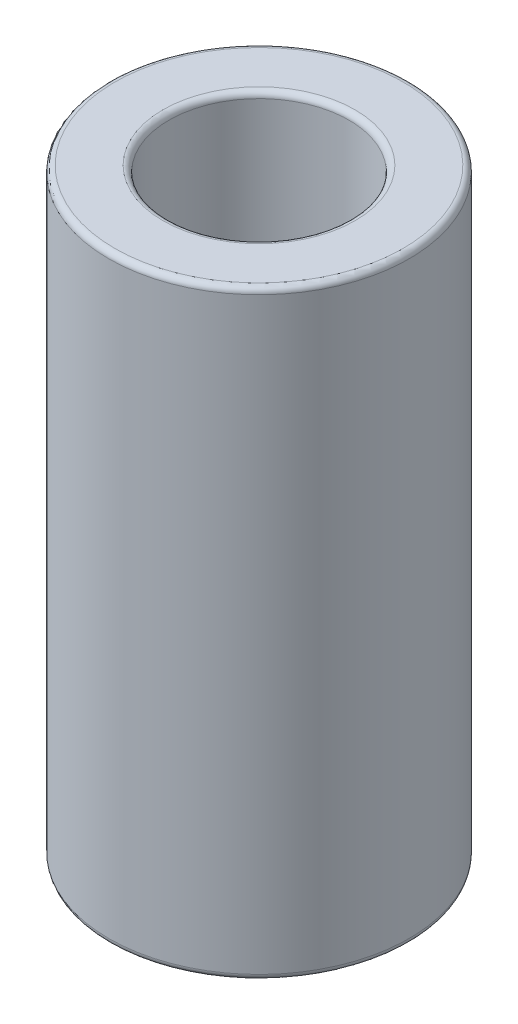
ISO-10303-21;
HEADER;
FILE_DESCRIPTION(('STEP AP214'),'2;1');
FILE_NAME('part.step','',(''),(''),'','','');
FILE_SCHEMA(('AUTOMOTIVE_DESIGN { 1 0 10303 214 1 1 1 1 }'));
ENDSEC;
DATA;
#1=APPLICATION_CONTEXT('core data for automotive mechanical design processes');
#2=APPLICATION_PROTOCOL_DEFINITION('international standard','automotive_design',2000,#1);
#3=PRODUCT_CONTEXT('',#1,'mechanical');
#4=PRODUCT('Part','Part','',(#3));
#5=PRODUCT_RELATED_PRODUCT_CATEGORY('part','',(#4));
#6=PRODUCT_DEFINITION_FORMATION('','',#4);
#7=PRODUCT_DEFINITION_CONTEXT('part definition',#1,'design');
#8=PRODUCT_DEFINITION('design','',#6,#7);
#9=PRODUCT_DEFINITION_SHAPE('','',#8);
#10=(LENGTH_UNIT() NAMED_UNIT(*) SI_UNIT(.MILLI.,.METRE.));
#11=(NAMED_UNIT(*) PLANE_ANGLE_UNIT() SI_UNIT($,.RADIAN.));
#12=(NAMED_UNIT(*) SI_UNIT($,.STERADIAN.) SOLID_ANGLE_UNIT());
#13=UNCERTAINTY_MEASURE_WITH_UNIT(LENGTH_MEASURE(1.E-05),#10,'distance_accuracy_value','');
#14=(GEOMETRIC_REPRESENTATION_CONTEXT(3) GLOBAL_UNCERTAINTY_ASSIGNED_CONTEXT((#13)) GLOBAL_UNIT_ASSIGNED_CONTEXT((#10,
#11,#12)) REPRESENTATION_CONTEXT('',''));
#15=CARTESIAN_POINT('',(0.,0.,0.));
#16=DIRECTION('',(0.,0.,1.));
#17=DIRECTION('',(1.,0.,0.));
#18=AXIS2_PLACEMENT_3D('',#15,#16,#17);
#19=CARTESIAN_POINT('',(0.,10.,0.));
#20=DIRECTION('',(0.,1.,0.));
#21=DIRECTION('',(0.,0.,1.));
#22=AXIS2_PLACEMENT_3D('',#19,#20,#21);
#23=PLANE('',#22);
#24=CARTESIAN_POINT('',(0.,10.,0.));
#25=DIRECTION('',(0.,1.,0.));
#26=DIRECTION('',(0.,0.,1.));
#27=AXIS2_PLACEMENT_3D('',#24,#25,#26);
#28=CIRCLE('',#27,1.6);
#29=CARTESIAN_POINT('',(0.,10.,1.6));
#30=VERTEX_POINT('',#29);
#31=EDGE_CURVE('E44',#30,#30,#28,.F.);
#32=ORIENTED_EDGE('',*,*,#31,.T.);
#33=EDGE_LOOP('',(#32));
#34=FACE_BOUND('',#33,.T.);
#35=CARTESIAN_POINT('',(0.,10.,0.));
#36=DIRECTION('',(0.,1.,0.));
#37=DIRECTION('',(0.,0.,1.));
#38=AXIS2_PLACEMENT_3D('',#35,#36,#37);
#39=CIRCLE('',#38,2.4);
#40=CARTESIAN_POINT('',(0.,10.,2.4));
#41=VERTEX_POINT('',#40);
#42=EDGE_CURVE('E48',#41,#41,#39,.T.);
#43=ORIENTED_EDGE('',*,*,#42,.T.);
#44=EDGE_LOOP('',(#43));
#45=FACE_BOUND('',#44,.T.);
#46=ADVANCED_FACE('F33',(#34,#45),#23,.T.);
#47=CARTESIAN_POINT('',(0.,0.,0.));
#48=DIRECTION('',(0.,1.,0.));
#49=DIRECTION('',(0.,0.,1.));
#50=AXIS2_PLACEMENT_3D('',#47,#48,#49);
#51=PLANE('',#50);
#52=CARTESIAN_POINT('',(0.,0.,0.));
#53=DIRECTION('',(0.,1.,0.));
#54=DIRECTION('',(0.,0.,1.));
#55=AXIS2_PLACEMENT_3D('',#52,#53,#54);
#56=CIRCLE('',#55,1.6);
#57=CARTESIAN_POINT('',(0.,0.,1.6));
#58=VERTEX_POINT('',#57);
#59=EDGE_CURVE('E59',#58,#58,#56,.T.);
#60=ORIENTED_EDGE('',*,*,#59,.T.);
#61=EDGE_LOOP('',(#60));
#62=FACE_BOUND('',#61,.T.);
#63=CARTESIAN_POINT('',(0.,0.,0.));
#64=DIRECTION('',(0.,1.,0.));
#65=DIRECTION('',(0.,0.,1.));
#66=AXIS2_PLACEMENT_3D('',#63,#64,#65);
#67=CIRCLE('',#66,2.4);
#68=CARTESIAN_POINT('',(0.,0.,2.4));
#69=VERTEX_POINT('',#68);
#70=EDGE_CURVE('E62',#69,#69,#67,.F.);
#71=ORIENTED_EDGE('',*,*,#70,.T.);
#72=EDGE_LOOP('',(#71));
#73=FACE_BOUND('',#72,.T.);
#74=ADVANCED_FACE('F66',(#62,#73),#51,.F.);
#75=CARTESIAN_POINT('',(0.,10.,0.));
#76=DIRECTION('',(0.,-1.,0.));
#77=DIRECTION('',(0.,0.,-1.));
#78=AXIS2_PLACEMENT_3D('',#75,#76,#77);
#79=CYLINDRICAL_SURFACE('',#78,2.5);
#80=CARTESIAN_POINT('',(0.,0.0999999999999994,0.));
#81=DIRECTION('',(0.,1.,0.));
#82=DIRECTION('',(0.,0.,1.));
#83=AXIS2_PLACEMENT_3D('',#80,#81,#82);
#84=CIRCLE('',#83,2.5);
#85=CARTESIAN_POINT('',(0.,0.0999999999999994,2.5));
#86=VERTEX_POINT('',#85);
#87=EDGE_CURVE('E10',#86,#86,#84,.T.);
#88=ORIENTED_EDGE('',*,*,#87,.T.);
#89=EDGE_LOOP('',(#88));
#90=FACE_BOUND('',#89,.T.);
#91=CARTESIAN_POINT('',(0.,9.9,0.));
#92=DIRECTION('',(0.,1.,0.));
#93=DIRECTION('',(0.,0.,1.));
#94=AXIS2_PLACEMENT_3D('',#91,#92,#93);
#95=CIRCLE('',#94,2.5);
#96=CARTESIAN_POINT('',(0.,9.9,2.5));
#97=VERTEX_POINT('',#96);
#98=EDGE_CURVE('E40',#97,#97,#95,.F.);
#99=ORIENTED_EDGE('',*,*,#98,.T.);
#100=EDGE_LOOP('',(#99));
#101=FACE_BOUND('',#100,.T.);
#102=ADVANCED_FACE('F86',(#90,#101),#79,.T.);
#103=CARTESIAN_POINT('',(0.,10.,0.));
#104=DIRECTION('',(0.,-1.,0.));
#105=DIRECTION('',(0.,0.,-1.));
#106=AXIS2_PLACEMENT_3D('',#103,#104,#105);
#107=CYLINDRICAL_SURFACE('',#106,1.5);
#108=CARTESIAN_POINT('',(0.,0.0999999999999994,0.));
#109=DIRECTION('',(0.,1.,0.));
#110=DIRECTION('',(0.,0.,1.));
#111=AXIS2_PLACEMENT_3D('',#108,#109,#110);
#112=CIRCLE('',#111,1.5);
#113=CARTESIAN_POINT('',(0.,0.0999999999999994,1.5));
#114=VERTEX_POINT('',#113);
#115=EDGE_CURVE('E53',#114,#114,#112,.F.);
#116=ORIENTED_EDGE('',*,*,#115,.T.);
#117=EDGE_LOOP('',(#116));
#118=FACE_BOUND('',#117,.T.);
#119=CARTESIAN_POINT('',(0.,9.9,0.));
#120=DIRECTION('',(0.,1.,0.));
#121=DIRECTION('',(0.,0.,1.));
#122=AXIS2_PLACEMENT_3D('',#119,#120,#121);
#123=CIRCLE('',#122,1.5);
#124=CARTESIAN_POINT('',(0.,9.9,1.5));
#125=VERTEX_POINT('',#124);
#126=EDGE_CURVE('E56',#125,#125,#123,.T.);
#127=ORIENTED_EDGE('',*,*,#126,.T.);
#128=EDGE_LOOP('',(#127));
#129=FACE_BOUND('',#128,.T.);
#130=ADVANCED_FACE('F91',(#118,#129),#107,.F.);
#131=CARTESIAN_POINT('',(0.,0.0999999999999994,0.));
#132=DIRECTION('',(0.,1.,0.));
#133=DIRECTION('',(0.,0.,1.));
#134=AXIS2_PLACEMENT_3D('',#131,#132,#133);
#135=TOROIDAL_SURFACE('',#134,1.6,0.1);
#136=ORIENTED_EDGE('',*,*,#115,.F.);
#137=EDGE_LOOP('',(#136));
#138=FACE_BOUND('',#137,.T.);
#139=ORIENTED_EDGE('',*,*,#59,.F.);
#140=EDGE_LOOP('',(#139));
#141=FACE_BOUND('',#140,.T.);
#142=ADVANCED_FACE('F77',(#138,#141),#135,.T.);
#143=CARTESIAN_POINT('',(0.,9.9,0.));
#144=DIRECTION('',(0.,1.,0.));
#145=DIRECTION('',(0.,0.,1.));
#146=AXIS2_PLACEMENT_3D('',#143,#144,#145);
#147=TOROIDAL_SURFACE('',#146,1.6,0.1);
#148=ORIENTED_EDGE('',*,*,#31,.F.);
#149=EDGE_LOOP('',(#148));
#150=FACE_BOUND('',#149,.T.);
#151=ORIENTED_EDGE('',*,*,#126,.F.);
#152=EDGE_LOOP('',(#151));
#153=FACE_BOUND('',#152,.T.);
#154=ADVANCED_FACE('F71',(#150,#153),#147,.T.);
#155=CARTESIAN_POINT('',(0.,0.0999999999999994,0.));
#156=DIRECTION('',(0.,1.,0.));
#157=DIRECTION('',(0.,0.,1.));
#158=AXIS2_PLACEMENT_3D('',#155,#156,#157);
#159=TOROIDAL_SURFACE('',#158,2.4,0.1);
#160=ORIENTED_EDGE('',*,*,#70,.F.);
#161=EDGE_LOOP('',(#160));
#162=FACE_BOUND('',#161,.T.);
#163=ORIENTED_EDGE('',*,*,#87,.F.);
#164=EDGE_LOOP('',(#163));
#165=FACE_BOUND('',#164,.T.);
#166=ADVANCED_FACE('F68',(#162,#165),#159,.T.);
#167=CARTESIAN_POINT('',(0.,9.9,0.));
#168=DIRECTION('',(0.,1.,0.));
#169=DIRECTION('',(0.,0.,1.));
#170=AXIS2_PLACEMENT_3D('',#167,#168,#169);
#171=TOROIDAL_SURFACE('',#170,2.4,0.1);
#172=ORIENTED_EDGE('',*,*,#98,.F.);
#173=EDGE_LOOP('',(#172));
#174=FACE_BOUND('',#173,.T.);
#175=ORIENTED_EDGE('',*,*,#42,.F.);
#176=EDGE_LOOP('',(#175));
#177=FACE_BOUND('',#176,.T.);
#178=ADVANCED_FACE('F35',(#174,#177),#171,.T.);
#179=CLOSED_SHELL('',(#46,#74,#102,#130,#142,#154,#166,#178));
#180=MANIFOLD_SOLID_BREP('B2',#179);
#181=ADVANCED_BREP_SHAPE_REPRESENTATION('',(#18,#180),#14);
#182=SHAPE_DEFINITION_REPRESENTATION(#9,#181);
ENDSEC;
END-ISO-10303-21;
